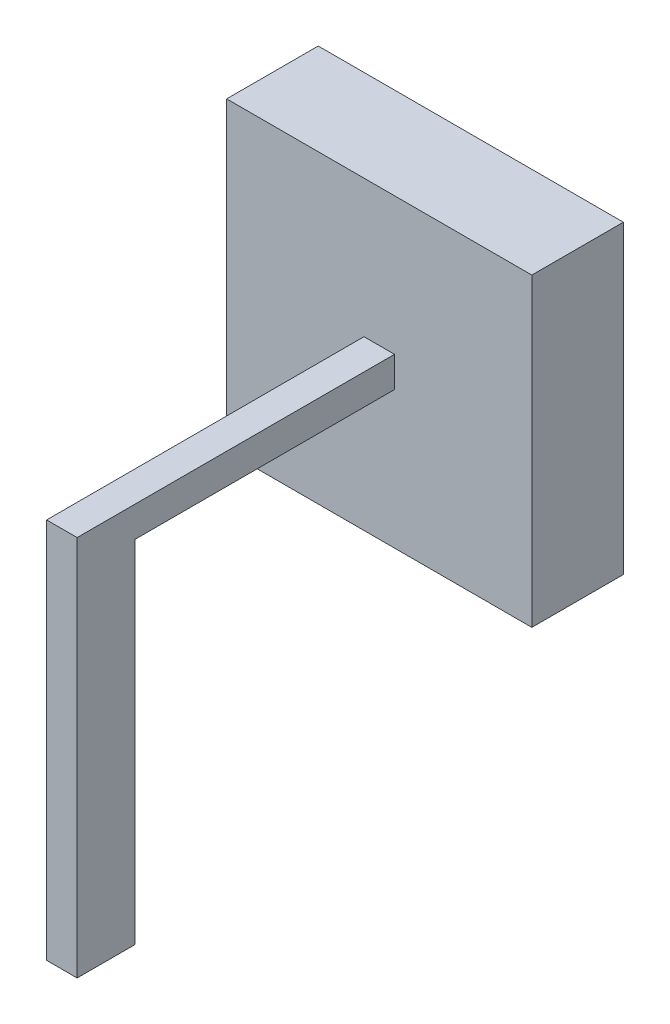
ISO-10303-21;
HEADER;
FILE_DESCRIPTION(('STEP AP214'),'2;1');
FILE_NAME('part.step','',(''),(''),'','','');
FILE_SCHEMA(('AUTOMOTIVE_DESIGN { 1 0 10303 214 1 1 1 1 }'));
ENDSEC;
DATA;
#1=APPLICATION_CONTEXT('core data for automotive mechanical design processes');
#2=APPLICATION_PROTOCOL_DEFINITION('international standard','automotive_design',2000,#1);
#3=PRODUCT_CONTEXT('',#1,'mechanical');
#4=PRODUCT('Part','Part','',(#3));
#5=PRODUCT_RELATED_PRODUCT_CATEGORY('part','',(#4));
#6=PRODUCT_DEFINITION_FORMATION('','',#4);
#7=PRODUCT_DEFINITION_CONTEXT('part definition',#1,'design');
#8=PRODUCT_DEFINITION('design','',#6,#7);
#9=PRODUCT_DEFINITION_SHAPE('','',#8);
#10=(LENGTH_UNIT() NAMED_UNIT(*) SI_UNIT(.MILLI.,.METRE.));
#11=(NAMED_UNIT(*) PLANE_ANGLE_UNIT() SI_UNIT($,.RADIAN.));
#12=(NAMED_UNIT(*) SI_UNIT($,.STERADIAN.) SOLID_ANGLE_UNIT());
#13=UNCERTAINTY_MEASURE_WITH_UNIT(LENGTH_MEASURE(1.E-05),#10,'distance_accuracy_value','');
#14=(GEOMETRIC_REPRESENTATION_CONTEXT(3) GLOBAL_UNCERTAINTY_ASSIGNED_CONTEXT((#13)) GLOBAL_UNIT_ASSIGNED_CONTEXT((#10,
#11,#12)) REPRESENTATION_CONTEXT('',''));
#15=CARTESIAN_POINT('',(0.,0.,0.));
#16=DIRECTION('',(0.,0.,1.));
#17=DIRECTION('',(1.,0.,0.));
#18=AXIS2_PLACEMENT_3D('',#15,#16,#17);
#19=CARTESIAN_POINT('',(0.,0.,0.));
#20=DIRECTION('',(0.,0.,1.));
#21=DIRECTION('',(1.,0.,0.));
#22=AXIS2_PLACEMENT_3D('',#19,#20,#21);
#23=PLANE('',#22);
#24=DIRECTION('',(0.,-1.,0.));
#25=VECTOR('',#24,1.);
#26=CARTESIAN_POINT('',(-5.,-5.,0.));
#27=LINE('',#26,#25);
#28=CARTESIAN_POINT('',(-5.,5.,0.));
#29=VERTEX_POINT('',#28);
#30=CARTESIAN_POINT('',(-5.,-5.,0.));
#31=VERTEX_POINT('',#30);
#32=EDGE_CURVE('E161',#29,#31,#27,.T.);
#33=ORIENTED_EDGE('',*,*,#32,.T.);
#34=DIRECTION('',(1.,0.,0.));
#35=VECTOR('',#34,1.);
#36=CARTESIAN_POINT('',(5.,-5.,0.));
#37=LINE('',#36,#35);
#38=CARTESIAN_POINT('',(5.,-5.,0.));
#39=VERTEX_POINT('',#38);
#40=EDGE_CURVE('E177',#31,#39,#37,.T.);
#41=ORIENTED_EDGE('',*,*,#40,.T.);
#42=DIRECTION('',(0.,1.,0.));
#43=VECTOR('',#42,1.);
#44=CARTESIAN_POINT('',(5.,-5.,0.));
#45=LINE('',#44,#43);
#46=CARTESIAN_POINT('',(5.,5.,0.));
#47=VERTEX_POINT('',#46);
#48=EDGE_CURVE('E180',#39,#47,#45,.T.);
#49=ORIENTED_EDGE('',*,*,#48,.T.);
#50=DIRECTION('',(-1.,0.,0.));
#51=VECTOR('',#50,1.);
#52=CARTESIAN_POINT('',(5.,5.,0.));
#53=LINE('',#52,#51);
#54=EDGE_CURVE('E166',#47,#29,#53,.T.);
#55=ORIENTED_EDGE('',*,*,#54,.T.);
#56=EDGE_LOOP('',(#33,#41,#49,#55));
#57=FACE_BOUND('',#56,.T.);
#58=DIRECTION('',(1.,0.,0.));
#59=VECTOR('',#58,1.);
#60=CARTESIAN_POINT('',(0.5,-0.5,0.));
#61=LINE('',#60,#59);
#62=CARTESIAN_POINT('',(-0.5,-0.5,0.));
#63=VERTEX_POINT('',#62);
#64=CARTESIAN_POINT('',(0.5,-0.5,0.));
#65=VERTEX_POINT('',#64);
#66=EDGE_CURVE('E149',#63,#65,#61,.T.);
#67=ORIENTED_EDGE('',*,*,#66,.F.);
#68=DIRECTION('',(0.,-1.,0.));
#69=VECTOR('',#68,1.);
#70=CARTESIAN_POINT('',(-0.5,-0.5,0.));
#71=LINE('',#70,#69);
#72=CARTESIAN_POINT('',(-0.5,0.5,0.));
#73=VERTEX_POINT('',#72);
#74=EDGE_CURVE('E139',#73,#63,#71,.T.);
#75=ORIENTED_EDGE('',*,*,#74,.F.);
#76=DIRECTION('',(-1.,0.,0.));
#77=VECTOR('',#76,1.);
#78=CARTESIAN_POINT('',(0.5,0.5,0.));
#79=LINE('',#78,#77);
#80=CARTESIAN_POINT('',(0.5,0.5,0.));
#81=VERTEX_POINT('',#80);
#82=EDGE_CURVE('E142',#81,#73,#79,.T.);
#83=ORIENTED_EDGE('',*,*,#82,.F.);
#84=DIRECTION('',(0.,1.,0.));
#85=VECTOR('',#84,1.);
#86=CARTESIAN_POINT('',(0.5,-0.5,0.));
#87=LINE('',#86,#85);
#88=EDGE_CURVE('E152',#65,#81,#87,.T.);
#89=ORIENTED_EDGE('',*,*,#88,.F.);
#90=EDGE_LOOP('',(#67,#75,#83,#89));
#91=FACE_BOUND('',#90,.T.);
#92=ADVANCED_FACE('F33',(#57,#91),#23,.T.);
#93=CARTESIAN_POINT('',(-5.,-5.,-3.));
#94=DIRECTION('',(-1.,0.,0.));
#95=DIRECTION('',(0.,0.,1.));
#96=AXIS2_PLACEMENT_3D('',#93,#94,#95);
#97=PLANE('',#96);
#98=ORIENTED_EDGE('',*,*,#32,.F.);
#99=DIRECTION('',(0.,0.,1.));
#100=VECTOR('',#99,1.);
#101=CARTESIAN_POINT('',(-5.,5.,-3.));
#102=LINE('',#101,#100);
#103=CARTESIAN_POINT('',(-5.,5.,-3.));
#104=VERTEX_POINT('',#103);
#105=EDGE_CURVE('E11',#104,#29,#102,.T.);
#106=ORIENTED_EDGE('',*,*,#105,.F.);
#107=DIRECTION('',(0.,-1.,0.));
#108=VECTOR('',#107,1.);
#109=CARTESIAN_POINT('',(-5.,-5.,-3.));
#110=LINE('',#109,#108);
#111=CARTESIAN_POINT('',(-5.,-5.,-3.));
#112=VERTEX_POINT('',#111);
#113=EDGE_CURVE('E162',#104,#112,#110,.T.);
#114=ORIENTED_EDGE('',*,*,#113,.T.);
#115=DIRECTION('',(0.,0.,1.));
#116=VECTOR('',#115,1.);
#117=CARTESIAN_POINT('',(-5.,-5.,-3.));
#118=LINE('',#117,#116);
#119=EDGE_CURVE('E37',#112,#31,#118,.T.);
#120=ORIENTED_EDGE('',*,*,#119,.T.);
#121=EDGE_LOOP('',(#98,#106,#114,#120));
#122=FACE_BOUND('',#121,.T.);
#123=ADVANCED_FACE('F35',(#122),#97,.T.);
#124=CARTESIAN_POINT('',(5.,5.,-3.));
#125=DIRECTION('',(0.,1.,0.));
#126=DIRECTION('',(0.,0.,1.));
#127=AXIS2_PLACEMENT_3D('',#124,#125,#126);
#128=PLANE('',#127);
#129=ORIENTED_EDGE('',*,*,#54,.F.);
#130=DIRECTION('',(0.,0.,1.));
#131=VECTOR('',#130,1.);
#132=CARTESIAN_POINT('',(5.,5.,-3.));
#133=LINE('',#132,#131);
#134=CARTESIAN_POINT('',(5.,5.,-3.));
#135=VERTEX_POINT('',#134);
#136=EDGE_CURVE('E42',#135,#47,#133,.T.);
#137=ORIENTED_EDGE('',*,*,#136,.F.);
#138=DIRECTION('',(-1.,0.,0.));
#139=VECTOR('',#138,1.);
#140=CARTESIAN_POINT('',(5.,5.,-3.));
#141=LINE('',#140,#139);
#142=EDGE_CURVE('E172',#135,#104,#141,.T.);
#143=ORIENTED_EDGE('',*,*,#142,.T.);
#144=ORIENTED_EDGE('',*,*,#105,.T.);
#145=EDGE_LOOP('',(#129,#137,#143,#144));
#146=FACE_BOUND('',#145,.T.);
#147=ADVANCED_FACE('F198',(#146),#128,.T.);
#148=CARTESIAN_POINT('',(5.,-5.,-3.));
#149=DIRECTION('',(1.,0.,0.));
#150=DIRECTION('',(0.,0.,-1.));
#151=AXIS2_PLACEMENT_3D('',#148,#149,#150);
#152=PLANE('',#151);
#153=ORIENTED_EDGE('',*,*,#48,.F.);
#154=DIRECTION('',(0.,0.,1.));
#155=VECTOR('',#154,1.);
#156=CARTESIAN_POINT('',(5.,-5.,-3.));
#157=LINE('',#156,#155);
#158=CARTESIAN_POINT('',(5.,-5.,-3.));
#159=VERTEX_POINT('',#158);
#160=EDGE_CURVE('E185',#159,#39,#157,.T.);
#161=ORIENTED_EDGE('',*,*,#160,.F.);
#162=DIRECTION('',(0.,1.,0.));
#163=VECTOR('',#162,1.);
#164=CARTESIAN_POINT('',(5.,-5.,-3.));
#165=LINE('',#164,#163);
#166=EDGE_CURVE('E169',#159,#135,#165,.T.);
#167=ORIENTED_EDGE('',*,*,#166,.T.);
#168=ORIENTED_EDGE('',*,*,#136,.T.);
#169=EDGE_LOOP('',(#153,#161,#167,#168));
#170=FACE_BOUND('',#169,.T.);
#171=ADVANCED_FACE('F204',(#170),#152,.T.);
#172=CARTESIAN_POINT('',(5.,-5.,-3.));
#173=DIRECTION('',(0.,-1.,0.));
#174=DIRECTION('',(1.,0.,0.));
#175=AXIS2_PLACEMENT_3D('',#172,#173,#174);
#176=PLANE('',#175);
#177=ORIENTED_EDGE('',*,*,#40,.F.);
#178=ORIENTED_EDGE('',*,*,#119,.F.);
#179=DIRECTION('',(1.,0.,0.));
#180=VECTOR('',#179,1.);
#181=CARTESIAN_POINT('',(5.,-5.,-3.));
#182=LINE('',#181,#180);
#183=EDGE_CURVE('E165',#112,#159,#182,.T.);
#184=ORIENTED_EDGE('',*,*,#183,.T.);
#185=ORIENTED_EDGE('',*,*,#160,.T.);
#186=EDGE_LOOP('',(#177,#178,#184,#185));
#187=FACE_BOUND('',#186,.T.);
#188=ADVANCED_FACE('F193',(#187),#176,.T.);
#189=CARTESIAN_POINT('',(0.,0.,-3.));
#190=DIRECTION('',(0.,0.,1.));
#191=DIRECTION('',(1.,0.,0.));
#192=AXIS2_PLACEMENT_3D('',#189,#190,#191);
#193=PLANE('',#192);
#194=ORIENTED_EDGE('',*,*,#113,.F.);
#195=ORIENTED_EDGE('',*,*,#142,.F.);
#196=ORIENTED_EDGE('',*,*,#166,.F.);
#197=ORIENTED_EDGE('',*,*,#183,.F.);
#198=EDGE_LOOP('',(#194,#195,#196,#197));
#199=FACE_BOUND('',#198,.T.);
#200=ADVANCED_FACE('F201',(#199),#193,.F.);
#201=CARTESIAN_POINT('',(-0.5,-0.5,10.4));
#202=DIRECTION('',(1.,0.,0.));
#203=DIRECTION('',(0.,0.,-1.));
#204=AXIS2_PLACEMENT_3D('',#201,#202,#203);
#205=PLANE('',#204);
#206=DIRECTION('',(0.,0.,-1.));
#207=VECTOR('',#206,1.);
#208=CARTESIAN_POINT('',(-0.5,-0.5,10.4));
#209=LINE('',#208,#207);
#210=CARTESIAN_POINT('',(-0.5,-0.5,8.5));
#211=VERTEX_POINT('',#210);
#212=EDGE_CURVE('E159',#211,#63,#209,.T.);
#213=ORIENTED_EDGE('',*,*,#212,.F.);
#214=DIRECTION('',(0.,1.,0.));
#215=VECTOR('',#214,1.);
#216=CARTESIAN_POINT('',(-0.499999999999999,-12.,8.5));
#217=LINE('',#216,#215);
#218=CARTESIAN_POINT('',(-0.499999999999999,-12.,8.5));
#219=VERTEX_POINT('',#218);
#220=EDGE_CURVE('E50',#219,#211,#217,.T.);
#221=ORIENTED_EDGE('',*,*,#220,.F.);
#222=DIRECTION('',(0.,0.,1.));
#223=VECTOR('',#222,1.);
#224=CARTESIAN_POINT('',(-0.499999999999999,-12.,10.4));
#225=LINE('',#224,#223);
#226=CARTESIAN_POINT('',(-0.499999999999999,-12.,10.4));
#227=VERTEX_POINT('',#226);
#228=EDGE_CURVE('E129',#219,#227,#225,.T.);
#229=ORIENTED_EDGE('',*,*,#228,.T.);
#230=DIRECTION('',(0.,-1.,0.));
#231=VECTOR('',#230,1.);
#232=CARTESIAN_POINT('',(-0.5,-0.5,10.4));
#233=LINE('',#232,#231);
#234=CARTESIAN_POINT('',(-0.5,0.5,10.4));
#235=VERTEX_POINT('',#234);
#236=EDGE_CURVE('E140',#235,#227,#233,.T.);
#237=ORIENTED_EDGE('',*,*,#236,.F.);
#238=DIRECTION('',(0.,0.,-1.));
#239=VECTOR('',#238,1.);
#240=CARTESIAN_POINT('',(-0.5,0.5,10.4));
#241=LINE('',#240,#239);
#242=EDGE_CURVE('E146',#235,#73,#241,.T.);
#243=ORIENTED_EDGE('',*,*,#242,.T.);
#244=ORIENTED_EDGE('',*,*,#74,.T.);
#245=EDGE_LOOP('',(#213,#221,#229,#237,#243,#244));
#246=FACE_BOUND('',#245,.T.);
#247=ADVANCED_FACE('F220',(#246),#205,.F.);
#248=CARTESIAN_POINT('',(0.5,-0.5,10.4));
#249=DIRECTION('',(0.,1.,0.));
#250=DIRECTION('',(-1.,0.,0.));
#251=AXIS2_PLACEMENT_3D('',#248,#249,#250);
#252=PLANE('',#251);
#253=DIRECTION('',(0.,0.,-1.));
#254=VECTOR('',#253,1.);
#255=CARTESIAN_POINT('',(0.5,-0.5,10.4));
#256=LINE('',#255,#254);
#257=CARTESIAN_POINT('',(0.5,-0.5,8.5));
#258=VERTEX_POINT('',#257);
#259=EDGE_CURVE('E157',#258,#65,#256,.T.);
#260=ORIENTED_EDGE('',*,*,#259,.F.);
#261=DIRECTION('',(-1.,0.,0.));
#262=VECTOR('',#261,1.);
#263=CARTESIAN_POINT('',(0.5,-0.5,8.5));
#264=LINE('',#263,#262);
#265=EDGE_CURVE('E115',#258,#211,#264,.T.);
#266=ORIENTED_EDGE('',*,*,#265,.T.);
#267=ORIENTED_EDGE('',*,*,#212,.T.);
#268=ORIENTED_EDGE('',*,*,#66,.T.);
#269=EDGE_LOOP('',(#260,#266,#267,#268));
#270=FACE_BOUND('',#269,.T.);
#271=ADVANCED_FACE('F223',(#270),#252,.F.);
#272=CARTESIAN_POINT('',(0.5,-0.5,10.4));
#273=DIRECTION('',(-1.,0.,0.));
#274=DIRECTION('',(0.,0.,1.));
#275=AXIS2_PLACEMENT_3D('',#272,#273,#274);
#276=PLANE('',#275);
#277=ORIENTED_EDGE('',*,*,#88,.T.);
#278=DIRECTION('',(0.,0.,-1.));
#279=VECTOR('',#278,1.);
#280=CARTESIAN_POINT('',(0.5,0.5,10.4));
#281=LINE('',#280,#279);
#282=CARTESIAN_POINT('',(0.5,0.5,10.4));
#283=VERTEX_POINT('',#282);
#284=EDGE_CURVE('E58',#283,#81,#281,.T.);
#285=ORIENTED_EDGE('',*,*,#284,.F.);
#286=DIRECTION('',(0.,1.,0.));
#287=VECTOR('',#286,1.);
#288=CARTESIAN_POINT('',(0.5,-0.5,10.4));
#289=LINE('',#288,#287);
#290=CARTESIAN_POINT('',(0.500000000000001,-12.,10.4));
#291=VERTEX_POINT('',#290);
#292=EDGE_CURVE('E132',#291,#283,#289,.T.);
#293=ORIENTED_EDGE('',*,*,#292,.F.);
#294=DIRECTION('',(0.,0.,-1.));
#295=VECTOR('',#294,1.);
#296=CARTESIAN_POINT('',(0.500000000000001,-12.,10.4));
#297=LINE('',#296,#295);
#298=CARTESIAN_POINT('',(0.500000000000001,-12.,8.5));
#299=VERTEX_POINT('',#298);
#300=EDGE_CURVE('E126',#291,#299,#297,.T.);
#301=ORIENTED_EDGE('',*,*,#300,.T.);
#302=DIRECTION('',(0.,1.,0.));
#303=VECTOR('',#302,1.);
#304=CARTESIAN_POINT('',(0.500000000000001,-12.,8.5));
#305=LINE('',#304,#303);
#306=EDGE_CURVE('E111',#299,#258,#305,.T.);
#307=ORIENTED_EDGE('',*,*,#306,.T.);
#308=ORIENTED_EDGE('',*,*,#259,.T.);
#309=EDGE_LOOP('',(#277,#285,#293,#301,#307,#308));
#310=FACE_BOUND('',#309,.T.);
#311=ADVANCED_FACE('F131',(#310),#276,.F.);
#312=CARTESIAN_POINT('',(0.5,0.5,10.4));
#313=DIRECTION('',(0.,-1.,0.));
#314=DIRECTION('',(1.,0.,0.));
#315=AXIS2_PLACEMENT_3D('',#312,#313,#314);
#316=PLANE('',#315);
#317=ORIENTED_EDGE('',*,*,#82,.T.);
#318=ORIENTED_EDGE('',*,*,#242,.F.);
#319=DIRECTION('',(-1.,0.,0.));
#320=VECTOR('',#319,1.);
#321=CARTESIAN_POINT('',(0.5,0.5,10.4));
#322=LINE('',#321,#320);
#323=EDGE_CURVE('E144',#283,#235,#322,.T.);
#324=ORIENTED_EDGE('',*,*,#323,.F.);
#325=ORIENTED_EDGE('',*,*,#284,.T.);
#326=EDGE_LOOP('',(#317,#318,#324,#325));
#327=FACE_BOUND('',#326,.T.);
#328=ADVANCED_FACE('F230',(#327),#316,.F.);
#329=CARTESIAN_POINT('',(0.,0.,10.4));
#330=DIRECTION('',(0.,0.,1.));
#331=DIRECTION('',(1.,0.,0.));
#332=AXIS2_PLACEMENT_3D('',#329,#330,#331);
#333=PLANE('',#332);
#334=ORIENTED_EDGE('',*,*,#236,.T.);
#335=DIRECTION('',(1.,0.,0.));
#336=VECTOR('',#335,1.);
#337=CARTESIAN_POINT('',(0.500000000000001,-12.,10.4));
#338=LINE('',#337,#336);
#339=EDGE_CURVE('E119',#227,#291,#338,.T.);
#340=ORIENTED_EDGE('',*,*,#339,.T.);
#341=ORIENTED_EDGE('',*,*,#292,.T.);
#342=ORIENTED_EDGE('',*,*,#323,.T.);
#343=EDGE_LOOP('',(#334,#340,#341,#342));
#344=FACE_BOUND('',#343,.T.);
#345=ADVANCED_FACE('F233',(#344),#333,.T.);
#346=CARTESIAN_POINT('',(0.500000000000001,-12.,8.5));
#347=DIRECTION('',(0.,0.,-1.));
#348=DIRECTION('',(-1.,0.,0.));
#349=AXIS2_PLACEMENT_3D('',#346,#347,#348);
#350=PLANE('',#349);
#351=ORIENTED_EDGE('',*,*,#265,.F.);
#352=ORIENTED_EDGE('',*,*,#306,.F.);
#353=DIRECTION('',(-1.,0.,0.));
#354=VECTOR('',#353,1.);
#355=CARTESIAN_POINT('',(0.500000000000001,-12.,8.5));
#356=LINE('',#355,#354);
#357=EDGE_CURVE('E114',#299,#219,#356,.T.);
#358=ORIENTED_EDGE('',*,*,#357,.T.);
#359=ORIENTED_EDGE('',*,*,#220,.T.);
#360=EDGE_LOOP('',(#351,#352,#358,#359));
#361=FACE_BOUND('',#360,.T.);
#362=ADVANCED_FACE('F113',(#361),#350,.T.);
#363=CARTESIAN_POINT('',(0.,-12.,0.));
#364=DIRECTION('',(0.,1.,0.));
#365=DIRECTION('',(-1.,0.,0.));
#366=AXIS2_PLACEMENT_3D('',#363,#364,#365);
#367=PLANE('',#366);
#368=ORIENTED_EDGE('',*,*,#300,.F.);
#369=ORIENTED_EDGE('',*,*,#339,.F.);
#370=ORIENTED_EDGE('',*,*,#228,.F.);
#371=ORIENTED_EDGE('',*,*,#357,.F.);
#372=EDGE_LOOP('',(#368,#369,#370,#371));
#373=FACE_BOUND('',#372,.T.);
#374=ADVANCED_FACE('F124',(#373),#367,.F.);
#375=CLOSED_SHELL('',(#92,#123,#147,#171,#188,#200,#247,#271,#311,#328,#345,#362,#374));
#376=MANIFOLD_SOLID_BREP('B2',#375);
#377=ADVANCED_BREP_SHAPE_REPRESENTATION('',(#18,#376),#14);
#378=SHAPE_DEFINITION_REPRESENTATION(#9,#377);
ENDSEC;
END-ISO-10303-21;
